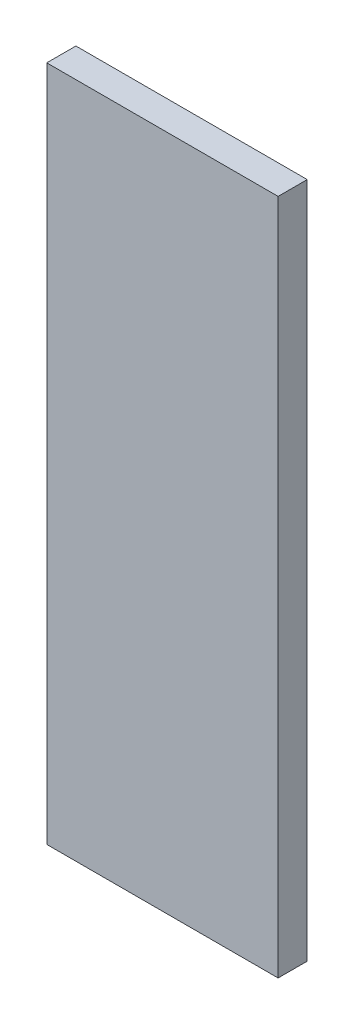
ISO-10303-21;
HEADER;
FILE_DESCRIPTION(('STEP AP214'),'2;1');
FILE_NAME('part.step','',(''),(''),'','','');
FILE_SCHEMA(('AUTOMOTIVE_DESIGN { 1 0 10303 214 1 1 1 1 }'));
ENDSEC;
DATA;
#1=APPLICATION_CONTEXT('core data for automotive mechanical design processes');
#2=APPLICATION_PROTOCOL_DEFINITION('international standard','automotive_design',2000,#1);
#3=PRODUCT_CONTEXT('',#1,'mechanical');
#4=PRODUCT('Part','Part','',(#3));
#5=PRODUCT_RELATED_PRODUCT_CATEGORY('part','',(#4));
#6=PRODUCT_DEFINITION_FORMATION('','',#4);
#7=PRODUCT_DEFINITION_CONTEXT('part definition',#1,'design');
#8=PRODUCT_DEFINITION('design','',#6,#7);
#9=PRODUCT_DEFINITION_SHAPE('','',#8);
#10=(LENGTH_UNIT() NAMED_UNIT(*) SI_UNIT(.MILLI.,.METRE.));
#11=(NAMED_UNIT(*) PLANE_ANGLE_UNIT() SI_UNIT($,.RADIAN.));
#12=(NAMED_UNIT(*) SI_UNIT($,.STERADIAN.) SOLID_ANGLE_UNIT());
#13=UNCERTAINTY_MEASURE_WITH_UNIT(LENGTH_MEASURE(1.E-05),#10,'distance_accuracy_value','');
#14=(GEOMETRIC_REPRESENTATION_CONTEXT(3) GLOBAL_UNCERTAINTY_ASSIGNED_CONTEXT((#13)) GLOBAL_UNIT_ASSIGNED_CONTEXT((#10,
#11,#12)) REPRESENTATION_CONTEXT('',''));
#15=CARTESIAN_POINT('',(0.,0.,0.));
#16=DIRECTION('',(0.,0.,1.));
#17=DIRECTION('',(1.,0.,0.));
#18=AXIS2_PLACEMENT_3D('',#15,#16,#17);
#19=CARTESIAN_POINT('',(0.67499992,-1.97498716,0.));
#20=DIRECTION('',(-1.,0.,0.));
#21=DIRECTION('',(0.,1.,0.));
#22=AXIS2_PLACEMENT_3D('',#19,#20,#21);
#23=PLANE('',#22);
#24=DIRECTION('',(0.,1.,0.));
#25=VECTOR('',#24,1.);
#26=CARTESIAN_POINT('',(0.67499992,-1.97498716,0.));
#27=LINE('',#26,#25);
#28=CARTESIAN_POINT('',(0.67499992,-1.97498716,0.));
#29=VERTEX_POINT('',#28);
#30=CARTESIAN_POINT('',(0.67499992,1.97498716,0.));
#31=VERTEX_POINT('',#30);
#32=EDGE_CURVE('E11',#29,#31,#27,.T.);
#33=ORIENTED_EDGE('',*,*,#32,.T.);
#34=DIRECTION('',(0.,0.,1.));
#35=VECTOR('',#34,1.);
#36=CARTESIAN_POINT('',(0.67499992,1.97498716,0.));
#37=LINE('',#36,#35);
#38=CARTESIAN_POINT('',(0.67499992,1.97498716,0.1700022));
#39=VERTEX_POINT('',#38);
#40=EDGE_CURVE('E24',#31,#39,#37,.T.);
#41=ORIENTED_EDGE('',*,*,#40,.T.);
#42=DIRECTION('',(0.,1.,0.));
#43=VECTOR('',#42,1.);
#44=CARTESIAN_POINT('',(0.67499992,-1.97498716,0.1700022));
#45=LINE('',#44,#43);
#46=CARTESIAN_POINT('',(0.67499992,-1.97498716,0.1700022));
#47=VERTEX_POINT('',#46);
#48=EDGE_CURVE('E87',#47,#39,#45,.T.);
#49=ORIENTED_EDGE('',*,*,#48,.F.);
#50=DIRECTION('',(0.,0.,1.));
#51=VECTOR('',#50,1.);
#52=CARTESIAN_POINT('',(0.67499992,-1.97498716,0.));
#53=LINE('',#52,#51);
#54=EDGE_CURVE('E36',#29,#47,#53,.T.);
#55=ORIENTED_EDGE('',*,*,#54,.F.);
#56=EDGE_LOOP('',(#33,#41,#49,#55));
#57=FACE_BOUND('',#56,.T.);
#58=ADVANCED_FACE('F17',(#57),#23,.F.);
#59=CARTESIAN_POINT('',(0.67499992,1.97498716,0.));
#60=DIRECTION('',(0.,-1.,0.));
#61=DIRECTION('',(-1.,0.,0.));
#62=AXIS2_PLACEMENT_3D('',#59,#60,#61);
#63=PLANE('',#62);
#64=DIRECTION('',(-1.,0.,0.));
#65=VECTOR('',#64,1.);
#66=CARTESIAN_POINT('',(0.67499992,1.97498716,0.));
#67=LINE('',#66,#65);
#68=CARTESIAN_POINT('',(-0.67499992,1.97498716,0.));
#69=VERTEX_POINT('',#68);
#70=EDGE_CURVE('E84',#31,#69,#67,.T.);
#71=ORIENTED_EDGE('',*,*,#70,.T.);
#72=DIRECTION('',(0.,0.,1.));
#73=VECTOR('',#72,1.);
#74=CARTESIAN_POINT('',(-0.67499992,1.97498716,0.));
#75=LINE('',#74,#73);
#76=CARTESIAN_POINT('',(-0.67499992,1.97498716,0.1700022));
#77=VERTEX_POINT('',#76);
#78=EDGE_CURVE('E82',#69,#77,#75,.T.);
#79=ORIENTED_EDGE('',*,*,#78,.T.);
#80=DIRECTION('',(-1.,0.,0.));
#81=VECTOR('',#80,1.);
#82=CARTESIAN_POINT('',(0.67499992,1.97498716,0.1700022));
#83=LINE('',#82,#81);
#84=EDGE_CURVE('E62',#39,#77,#83,.T.);
#85=ORIENTED_EDGE('',*,*,#84,.F.);
#86=ORIENTED_EDGE('',*,*,#40,.F.);
#87=EDGE_LOOP('',(#71,#79,#85,#86));
#88=FACE_BOUND('',#87,.T.);
#89=ADVANCED_FACE('F89',(#88),#63,.F.);
#90=CARTESIAN_POINT('',(-0.67499992,1.97498716,0.));
#91=DIRECTION('',(1.,0.,0.));
#92=DIRECTION('',(0.,-1.,0.));
#93=AXIS2_PLACEMENT_3D('',#90,#91,#92);
#94=PLANE('',#93);
#95=DIRECTION('',(0.,-1.,0.));
#96=VECTOR('',#95,1.);
#97=CARTESIAN_POINT('',(-0.67499992,1.97498716,0.));
#98=LINE('',#97,#96);
#99=CARTESIAN_POINT('',(-0.67499992,-1.97498716,0.));
#100=VERTEX_POINT('',#99);
#101=EDGE_CURVE('E71',#69,#100,#98,.T.);
#102=ORIENTED_EDGE('',*,*,#101,.T.);
#103=DIRECTION('',(0.,0.,1.));
#104=VECTOR('',#103,1.);
#105=CARTESIAN_POINT('',(-0.67499992,-1.97498716,0.));
#106=LINE('',#105,#104);
#107=CARTESIAN_POINT('',(-0.67499992,-1.97498716,0.1700022));
#108=VERTEX_POINT('',#107);
#109=EDGE_CURVE('E65',#100,#108,#106,.T.);
#110=ORIENTED_EDGE('',*,*,#109,.T.);
#111=DIRECTION('',(0.,-1.,0.));
#112=VECTOR('',#111,1.);
#113=CARTESIAN_POINT('',(-0.67499992,1.97498716,0.1700022));
#114=LINE('',#113,#112);
#115=EDGE_CURVE('E57',#77,#108,#114,.T.);
#116=ORIENTED_EDGE('',*,*,#115,.F.);
#117=ORIENTED_EDGE('',*,*,#78,.F.);
#118=EDGE_LOOP('',(#102,#110,#116,#117));
#119=FACE_BOUND('',#118,.T.);
#120=ADVANCED_FACE('F69',(#119),#94,.F.);
#121=CARTESIAN_POINT('',(-0.67499992,-1.97498716,0.));
#122=DIRECTION('',(0.,1.,0.));
#123=DIRECTION('',(1.,0.,0.));
#124=AXIS2_PLACEMENT_3D('',#121,#122,#123);
#125=PLANE('',#124);
#126=DIRECTION('',(1.,0.,0.));
#127=VECTOR('',#126,1.);
#128=CARTESIAN_POINT('',(-0.67499992,-1.97498716,0.));
#129=LINE('',#128,#127);
#130=EDGE_CURVE('E66',#100,#29,#129,.T.);
#131=ORIENTED_EDGE('',*,*,#130,.T.);
#132=ORIENTED_EDGE('',*,*,#54,.T.);
#133=DIRECTION('',(1.,0.,0.));
#134=VECTOR('',#133,1.);
#135=CARTESIAN_POINT('',(-0.67499992,-1.97498716,0.1700022));
#136=LINE('',#135,#134);
#137=EDGE_CURVE('E61',#108,#47,#136,.T.);
#138=ORIENTED_EDGE('',*,*,#137,.F.);
#139=ORIENTED_EDGE('',*,*,#109,.F.);
#140=EDGE_LOOP('',(#131,#132,#138,#139));
#141=FACE_BOUND('',#140,.T.);
#142=ADVANCED_FACE('F76',(#141),#125,.F.);
#143=CARTESIAN_POINT('',(0.,0.,0.));
#144=DIRECTION('',(0.,0.,1.));
#145=DIRECTION('',(1.,0.,0.));
#146=AXIS2_PLACEMENT_3D('',#143,#144,#145);
#147=PLANE('',#146);
#148=ORIENTED_EDGE('',*,*,#130,.F.);
#149=ORIENTED_EDGE('',*,*,#101,.F.);
#150=ORIENTED_EDGE('',*,*,#70,.F.);
#151=ORIENTED_EDGE('',*,*,#32,.F.);
#152=EDGE_LOOP('',(#148,#149,#150,#151));
#153=FACE_BOUND('',#152,.T.);
#154=ADVANCED_FACE('F91',(#153),#147,.F.);
#155=CARTESIAN_POINT('',(0.,0.,0.1700022));
#156=DIRECTION('',(0.,0.,1.));
#157=DIRECTION('',(1.,0.,0.));
#158=AXIS2_PLACEMENT_3D('',#155,#156,#157);
#159=PLANE('',#158);
#160=ORIENTED_EDGE('',*,*,#48,.T.);
#161=ORIENTED_EDGE('',*,*,#84,.T.);
#162=ORIENTED_EDGE('',*,*,#115,.T.);
#163=ORIENTED_EDGE('',*,*,#137,.T.);
#164=EDGE_LOOP('',(#160,#161,#162,#163));
#165=FACE_BOUND('',#164,.T.);
#166=ADVANCED_FACE('F59',(#165),#159,.T.);
#167=CLOSED_SHELL('',(#58,#89,#120,#142,#154,#166));
#168=MANIFOLD_SOLID_BREP('B1',#167);
#169=ADVANCED_BREP_SHAPE_REPRESENTATION('',(#18,#168),#14);
#170=SHAPE_DEFINITION_REPRESENTATION(#9,#169);
ENDSEC;
END-ISO-10303-21;
